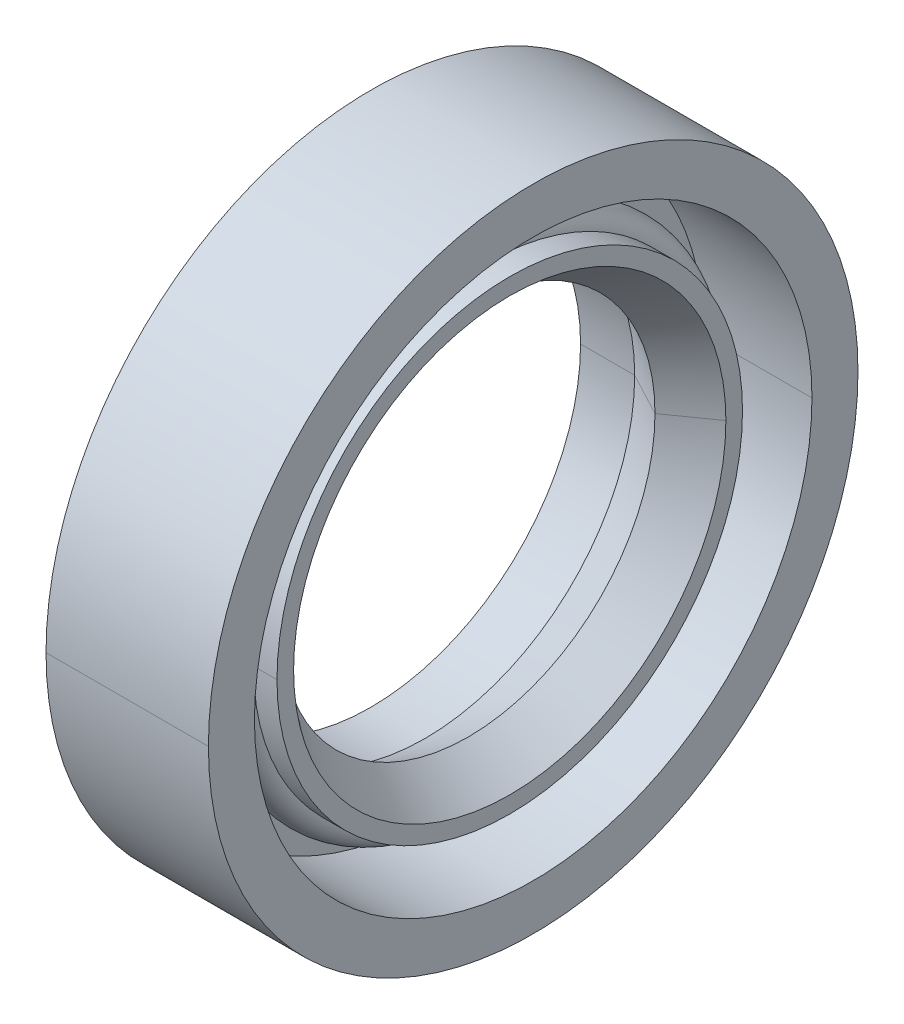
ISO-10303-21;
HEADER;
FILE_DESCRIPTION(('STEP AP214'),'2;1');
FILE_NAME('part.step','',(''),(''),'','','');
FILE_SCHEMA(('AUTOMOTIVE_DESIGN { 1 0 10303 214 1 1 1 1 }'));
ENDSEC;
DATA;
#1=APPLICATION_CONTEXT('core data for automotive mechanical design processes');
#2=APPLICATION_PROTOCOL_DEFINITION('international standard','automotive_design',2000,#1);
#3=PRODUCT_CONTEXT('',#1,'mechanical');
#4=PRODUCT('Part','Part','',(#3));
#5=PRODUCT_RELATED_PRODUCT_CATEGORY('part','',(#4));
#6=PRODUCT_DEFINITION_FORMATION('','',#4);
#7=PRODUCT_DEFINITION_CONTEXT('part definition',#1,'design');
#8=PRODUCT_DEFINITION('design','',#6,#7);
#9=PRODUCT_DEFINITION_SHAPE('','',#8);
#10=(LENGTH_UNIT() NAMED_UNIT(*) SI_UNIT(.MILLI.,.METRE.));
#11=(NAMED_UNIT(*) PLANE_ANGLE_UNIT() SI_UNIT($,.RADIAN.));
#12=(NAMED_UNIT(*) SI_UNIT($,.STERADIAN.) SOLID_ANGLE_UNIT());
#13=UNCERTAINTY_MEASURE_WITH_UNIT(LENGTH_MEASURE(1.E-05),#10,'distance_accuracy_value','');
#14=(GEOMETRIC_REPRESENTATION_CONTEXT(3) GLOBAL_UNCERTAINTY_ASSIGNED_CONTEXT((#13)) GLOBAL_UNIT_ASSIGNED_CONTEXT((#10,
#11,#12)) REPRESENTATION_CONTEXT('',''));
#15=CARTESIAN_POINT('',(0.,0.,0.));
#16=DIRECTION('',(0.,0.,1.));
#17=DIRECTION('',(1.,0.,0.));
#18=AXIS2_PLACEMENT_3D('',#15,#16,#17);
#19=CARTESIAN_POINT('',(10.,0.,0.));
#20=DIRECTION('',(1.,0.,0.));
#21=DIRECTION('',(0.,1.,0.));
#22=AXIS2_PLACEMENT_3D('',#19,#20,#21);
#23=CYLINDRICAL_SURFACE('',#22,20.);
#24=DIRECTION('',(1.,0.,0.));
#25=VECTOR('',#24,1.);
#26=CARTESIAN_POINT('',(0.,0.,20.));
#27=LINE('',#26,#25);
#28=CARTESIAN_POINT('',(0.,0.,20.));
#29=VERTEX_POINT('',#28);
#30=CARTESIAN_POINT('',(10.,0.,20.));
#31=VERTEX_POINT('',#30);
#32=EDGE_CURVE('E10',#29,#31,#27,.T.);
#33=ORIENTED_EDGE('',*,*,#32,.F.);
#34=CARTESIAN_POINT('',(0.,0.,0.));
#35=DIRECTION('',(1.,0.,0.));
#36=DIRECTION('',(0.,0.,-1.));
#37=AXIS2_PLACEMENT_3D('',#34,#35,#36);
#38=CIRCLE('',#37,20.);
#39=CARTESIAN_POINT('',(0.,0.,-20.));
#40=VERTEX_POINT('',#39);
#41=EDGE_CURVE('E24',#29,#40,#38,.T.);
#42=ORIENTED_EDGE('',*,*,#41,.T.);
#43=DIRECTION('',(1.,0.,0.));
#44=VECTOR('',#43,1.);
#45=CARTESIAN_POINT('',(0.,0.,-20.));
#46=LINE('',#45,#44);
#47=CARTESIAN_POINT('',(10.,0.,-20.));
#48=VERTEX_POINT('',#47);
#49=EDGE_CURVE('E319',#40,#48,#46,.T.);
#50=ORIENTED_EDGE('',*,*,#49,.T.);
#51=CARTESIAN_POINT('',(10.,0.,0.));
#52=DIRECTION('',(1.,0.,0.));
#53=DIRECTION('',(0.,0.,-1.));
#54=AXIS2_PLACEMENT_3D('',#51,#52,#53);
#55=CIRCLE('',#54,20.);
#56=EDGE_CURVE('E314',#31,#48,#55,.T.);
#57=ORIENTED_EDGE('',*,*,#56,.F.);
#58=EDGE_LOOP('',(#33,#42,#50,#57));
#59=FACE_BOUND('',#58,.T.);
#60=ADVANCED_FACE('F16',(#59),#23,.T.);
#61=CARTESIAN_POINT('',(10.,17.166666666667,0.));
#62=DIRECTION('',(1.,0.,0.));
#63=DIRECTION('',(0.,0.,-1.));
#64=AXIS2_PLACEMENT_3D('',#61,#62,#63);
#65=PLANE('',#64);
#66=CARTESIAN_POINT('',(10.,0.,0.));
#67=DIRECTION('',(1.,0.,0.));
#68=DIRECTION('',(0.,0.,-1.));
#69=AXIS2_PLACEMENT_3D('',#66,#67,#68);
#70=CIRCLE('',#69,20.);
#71=EDGE_CURVE('E309',#48,#31,#70,.T.);
#72=ORIENTED_EDGE('',*,*,#71,.T.);
#73=ORIENTED_EDGE('',*,*,#56,.T.);
#74=EDGE_LOOP('',(#72,#73));
#75=FACE_BOUND('',#74,.T.);
#76=CARTESIAN_POINT('',(10.,0.,0.));
#77=DIRECTION('',(1.,0.,0.));
#78=DIRECTION('',(0.,0.,-1.));
#79=AXIS2_PLACEMENT_3D('',#76,#77,#78);
#80=CIRCLE('',#79,17.166666666667);
#81=CARTESIAN_POINT('',(10.,0.,17.166666666667));
#82=VERTEX_POINT('',#81);
#83=CARTESIAN_POINT('',(10.,0.,-17.166666666667));
#84=VERTEX_POINT('',#83);
#85=EDGE_CURVE('E304',#82,#84,#80,.T.);
#86=ORIENTED_EDGE('',*,*,#85,.F.);
#87=CARTESIAN_POINT('',(10.,0.,0.));
#88=DIRECTION('',(1.,0.,0.));
#89=DIRECTION('',(0.,0.,-1.));
#90=AXIS2_PLACEMENT_3D('',#87,#88,#89);
#91=CIRCLE('',#90,17.166666666667);
#92=EDGE_CURVE('E299',#84,#82,#91,.T.);
#93=ORIENTED_EDGE('',*,*,#92,.F.);
#94=EDGE_LOOP('',(#86,#93));
#95=FACE_BOUND('',#94,.T.);
#96=ADVANCED_FACE('F332',(#75,#95),#65,.T.);
#97=CARTESIAN_POINT('',(10.,0.,0.));
#98=DIRECTION('',(1.,0.,0.));
#99=DIRECTION('',(0.,-1.,0.));
#100=AXIS2_PLACEMENT_3D('',#97,#98,#99);
#101=CYLINDRICAL_SURFACE('',#100,17.166666666667);
#102=DIRECTION('',(1.,0.,0.));
#103=VECTOR('',#102,1.);
#104=CARTESIAN_POINT('',(3.3333333333333,0.,17.166666666667));
#105=LINE('',#104,#103);
#106=CARTESIAN_POINT('',(3.3333333333333,0.,17.166666666667));
#107=VERTEX_POINT('',#106);
#108=EDGE_CURVE('E294',#107,#82,#105,.T.);
#109=ORIENTED_EDGE('',*,*,#108,.F.);
#110=CARTESIAN_POINT('',(3.3333333333333,0.,0.));
#111=DIRECTION('',(1.,0.,0.));
#112=DIRECTION('',(0.,0.,-1.));
#113=AXIS2_PLACEMENT_3D('',#110,#111,#112);
#114=CIRCLE('',#113,17.166666666667);
#115=CARTESIAN_POINT('',(3.3333333333333,0.,-17.166666666667));
#116=VERTEX_POINT('',#115);
#117=EDGE_CURVE('E289',#116,#107,#114,.T.);
#118=ORIENTED_EDGE('',*,*,#117,.F.);
#119=DIRECTION('',(1.,0.,0.));
#120=VECTOR('',#119,1.);
#121=CARTESIAN_POINT('',(3.3333333333333,0.,-17.166666666667));
#122=LINE('',#121,#120);
#123=EDGE_CURVE('E284',#116,#84,#122,.T.);
#124=ORIENTED_EDGE('',*,*,#123,.T.);
#125=ORIENTED_EDGE('',*,*,#92,.T.);
#126=EDGE_LOOP('',(#109,#118,#124,#125));
#127=FACE_BOUND('',#126,.T.);
#128=ADVANCED_FACE('F335',(#127),#101,.F.);
#129=CARTESIAN_POINT('',(10.,0.,0.));
#130=DIRECTION('',(1.,0.,0.));
#131=DIRECTION('',(0.,1.,0.));
#132=AXIS2_PLACEMENT_3D('',#129,#130,#131);
#133=CYLINDRICAL_SURFACE('',#132,17.166666666667);
#134=ORIENTED_EDGE('',*,*,#108,.T.);
#135=ORIENTED_EDGE('',*,*,#85,.T.);
#136=ORIENTED_EDGE('',*,*,#123,.F.);
#137=CARTESIAN_POINT('',(3.3333333333333,0.,0.));
#138=DIRECTION('',(1.,0.,0.));
#139=DIRECTION('',(0.,0.,-1.));
#140=AXIS2_PLACEMENT_3D('',#137,#138,#139);
#141=CIRCLE('',#140,17.166666666667);
#142=EDGE_CURVE('E279',#107,#116,#141,.T.);
#143=ORIENTED_EDGE('',*,*,#142,.F.);
#144=EDGE_LOOP('',(#134,#135,#136,#143));
#145=FACE_BOUND('',#144,.T.);
#146=ADVANCED_FACE('F339',(#145),#133,.F.);
#147=CARTESIAN_POINT('',(3.3333333333333,14.333333333333,0.));
#148=DIRECTION('',(1.,0.,0.));
#149=DIRECTION('',(0.,0.,-1.));
#150=AXIS2_PLACEMENT_3D('',#147,#148,#149);
#151=PLANE('',#150);
#152=ORIENTED_EDGE('',*,*,#117,.T.);
#153=ORIENTED_EDGE('',*,*,#142,.T.);
#154=EDGE_LOOP('',(#152,#153));
#155=FACE_BOUND('',#154,.T.);
#156=CARTESIAN_POINT('',(3.3333333333333,0.,0.));
#157=DIRECTION('',(1.,0.,0.));
#158=DIRECTION('',(0.,0.,-1.));
#159=AXIS2_PLACEMENT_3D('',#156,#157,#158);
#160=CIRCLE('',#159,14.333333333333);
#161=CARTESIAN_POINT('',(3.3333333333333,0.,14.333333333333));
#162=VERTEX_POINT('',#161);
#163=CARTESIAN_POINT('',(3.3333333333333,0.,-14.333333333333));
#164=VERTEX_POINT('',#163);
#165=EDGE_CURVE('E274',#162,#164,#160,.T.);
#166=ORIENTED_EDGE('',*,*,#165,.F.);
#167=CARTESIAN_POINT('',(3.3333333333333,0.,0.));
#168=DIRECTION('',(1.,0.,0.));
#169=DIRECTION('',(0.,0.,-1.));
#170=AXIS2_PLACEMENT_3D('',#167,#168,#169);
#171=CIRCLE('',#170,14.333333333333);
#172=EDGE_CURVE('E269',#164,#162,#171,.T.);
#173=ORIENTED_EDGE('',*,*,#172,.F.);
#174=EDGE_LOOP('',(#166,#173));
#175=FACE_BOUND('',#174,.T.);
#176=ADVANCED_FACE('F342',(#155,#175),#151,.T.);
#177=CARTESIAN_POINT('',(10.,0.,0.));
#178=DIRECTION('',(1.,0.,0.));
#179=DIRECTION('',(0.,-1.,0.));
#180=AXIS2_PLACEMENT_3D('',#177,#178,#179);
#181=CYLINDRICAL_SURFACE('',#180,14.333333333333);
#182=DIRECTION('',(1.,0.,0.));
#183=VECTOR('',#182,1.);
#184=CARTESIAN_POINT('',(3.3333333333333,0.,14.333333333333));
#185=LINE('',#184,#183);
#186=CARTESIAN_POINT('',(4.888889,0.,14.333333333333));
#187=VERTEX_POINT('',#186);
#188=EDGE_CURVE('E265',#162,#187,#185,.T.);
#189=ORIENTED_EDGE('',*,*,#188,.T.);
#190=CARTESIAN_POINT('',(4.888889,0.,0.));
#191=DIRECTION('',(1.,0.,0.));
#192=DIRECTION('',(0.,0.,-1.));
#193=AXIS2_PLACEMENT_3D('',#190,#191,#192);
#194=CIRCLE('',#193,14.333333333333);
#195=CARTESIAN_POINT('',(4.888889,13.6318100668969,4.42924358604081));
#196=VERTEX_POINT('',#195);
#197=EDGE_CURVE('E260',#196,#187,#194,.T.);
#198=ORIENTED_EDGE('',*,*,#197,.F.);
#199=CARTESIAN_POINT('',(4.888889,0.,0.));
#200=DIRECTION('',(1.,0.,0.));
#201=DIRECTION('',(0.,0.,-1.));
#202=AXIS2_PLACEMENT_3D('',#199,#200,#201);
#203=CIRCLE('',#202,14.333333333333);
#204=CARTESIAN_POINT('',(4.888889,0.,-14.333333333333));
#205=VERTEX_POINT('',#204);
#206=EDGE_CURVE('E255',#205,#196,#203,.T.);
#207=ORIENTED_EDGE('',*,*,#206,.F.);
#208=DIRECTION('',(1.,0.,0.));
#209=VECTOR('',#208,1.);
#210=CARTESIAN_POINT('',(3.3333333333333,0.,-14.333333333333));
#211=LINE('',#210,#209);
#212=EDGE_CURVE('E250',#164,#205,#211,.T.);
#213=ORIENTED_EDGE('',*,*,#212,.F.);
#214=ORIENTED_EDGE('',*,*,#172,.T.);
#215=EDGE_LOOP('',(#189,#198,#207,#213,#214));
#216=FACE_BOUND('',#215,.T.);
#217=ADVANCED_FACE('F345',(#216),#181,.T.);
#218=CARTESIAN_POINT('',(10.,0.,0.));
#219=DIRECTION('',(1.,0.,0.));
#220=DIRECTION('',(0.,1.,0.));
#221=AXIS2_PLACEMENT_3D('',#218,#219,#220);
#222=CYLINDRICAL_SURFACE('',#221,14.333333333333);
#223=ORIENTED_EDGE('',*,*,#188,.F.);
#224=ORIENTED_EDGE('',*,*,#165,.T.);
#225=ORIENTED_EDGE('',*,*,#212,.T.);
#226=CARTESIAN_POINT('',(4.888889,0.,0.));
#227=DIRECTION('',(1.,0.,0.));
#228=DIRECTION('',(0.,0.,-1.));
#229=AXIS2_PLACEMENT_3D('',#226,#227,#228);
#230=CIRCLE('',#229,14.333333333333);
#231=CARTESIAN_POINT('',(4.888889,-13.6318100668969,-4.42924358604081));
#232=VERTEX_POINT('',#231);
#233=EDGE_CURVE('E245',#232,#205,#230,.T.);
#234=ORIENTED_EDGE('',*,*,#233,.F.);
#235=CARTESIAN_POINT('',(4.888889,0.,0.));
#236=DIRECTION('',(1.,0.,0.));
#237=DIRECTION('',(0.,0.,-1.));
#238=AXIS2_PLACEMENT_3D('',#235,#236,#237);
#239=CIRCLE('',#238,14.333333333333);
#240=EDGE_CURVE('E240',#187,#232,#239,.T.);
#241=ORIENTED_EDGE('',*,*,#240,.F.);
#242=EDGE_LOOP('',(#223,#224,#225,#234,#241));
#243=FACE_BOUND('',#242,.T.);
#244=ADVANCED_FACE('F351',(#243),#222,.T.);
#245=CARTESIAN_POINT('',(6.,0.,0.));
#246=DIRECTION('',(1.,0.,0.));
#247=DIRECTION('',(0.,0.309016994374947,-0.951056516295154));
#248=AXIS2_PLACEMENT_3D('',#245,#246,#247);
#249=TOROIDAL_SURFACE('',#248,14.333333333333,1.111111);
#250=CARTESIAN_POINT('',(6.,-13.6318100668969,-4.42924358604081));
#251=DIRECTION('',(0.,0.309016994374947,-0.951056516295154));
#252=DIRECTION('',(1.,0.,0.));
#253=AXIS2_PLACEMENT_3D('',#250,#251,#252);
#254=CIRCLE('',#253,1.111111);
#255=CARTESIAN_POINT('',(7.111111,-13.6318100668969,-4.42924358604081));
#256=VERTEX_POINT('',#255);
#257=EDGE_CURVE('E235',#256,#232,#254,.T.);
#258=ORIENTED_EDGE('',*,*,#257,.F.);
#259=CARTESIAN_POINT('',(7.111111,0.,0.));
#260=DIRECTION('',(1.,0.,0.));
#261=DIRECTION('',(0.,0.,-1.));
#262=AXIS2_PLACEMENT_3D('',#259,#260,#261);
#263=CIRCLE('',#262,14.333333333333);
#264=CARTESIAN_POINT('',(7.111111,0.,14.333333333333));
#265=VERTEX_POINT('',#264);
#266=EDGE_CURVE('E230',#265,#256,#263,.T.);
#267=ORIENTED_EDGE('',*,*,#266,.F.);
#268=CARTESIAN_POINT('',(7.111111,0.,0.));
#269=DIRECTION('',(1.,0.,0.));
#270=DIRECTION('',(0.,0.,-1.));
#271=AXIS2_PLACEMENT_3D('',#268,#269,#270);
#272=CIRCLE('',#271,14.333333333333);
#273=CARTESIAN_POINT('',(7.111111,13.6318100668969,4.42924358604081));
#274=VERTEX_POINT('',#273);
#275=EDGE_CURVE('E225',#274,#265,#272,.T.);
#276=ORIENTED_EDGE('',*,*,#275,.F.);
#277=CARTESIAN_POINT('',(6.,13.6318100668969,4.42924358604081));
#278=DIRECTION('',(0.,-0.309016994374947,0.951056516295154));
#279=DIRECTION('',(1.,0.,0.));
#280=AXIS2_PLACEMENT_3D('',#277,#278,#279);
#281=CIRCLE('',#280,1.111111);
#282=EDGE_CURVE('E220',#274,#196,#281,.T.);
#283=ORIENTED_EDGE('',*,*,#282,.T.);
#284=ORIENTED_EDGE('',*,*,#197,.T.);
#285=ORIENTED_EDGE('',*,*,#240,.T.);
#286=EDGE_LOOP('',(#258,#267,#276,#283,#284,#285));
#287=FACE_BOUND('',#286,.T.);
#288=ADVANCED_FACE('F358',(#287),#249,.T.);
#289=CARTESIAN_POINT('',(6.,0.,0.));
#290=DIRECTION('',(1.,0.,0.));
#291=DIRECTION('',(0.,-0.309016994374947,0.951056516295154));
#292=AXIS2_PLACEMENT_3D('',#289,#290,#291);
#293=TOROIDAL_SURFACE('',#292,14.333333333333,1.111111);
#294=ORIENTED_EDGE('',*,*,#257,.T.);
#295=ORIENTED_EDGE('',*,*,#233,.T.);
#296=ORIENTED_EDGE('',*,*,#206,.T.);
#297=ORIENTED_EDGE('',*,*,#282,.F.);
#298=CARTESIAN_POINT('',(7.111111,0.,0.));
#299=DIRECTION('',(1.,0.,0.));
#300=DIRECTION('',(0.,0.,-1.));
#301=AXIS2_PLACEMENT_3D('',#298,#299,#300);
#302=CIRCLE('',#301,14.333333333333);
#303=CARTESIAN_POINT('',(7.111111,0.,-14.333333333333));
#304=VERTEX_POINT('',#303);
#305=EDGE_CURVE('E215',#304,#274,#302,.T.);
#306=ORIENTED_EDGE('',*,*,#305,.F.);
#307=CARTESIAN_POINT('',(7.111111,0.,0.));
#308=DIRECTION('',(1.,0.,0.));
#309=DIRECTION('',(0.,0.,-1.));
#310=AXIS2_PLACEMENT_3D('',#307,#308,#309);
#311=CIRCLE('',#310,14.333333333333);
#312=EDGE_CURVE('E210',#256,#304,#311,.T.);
#313=ORIENTED_EDGE('',*,*,#312,.F.);
#314=EDGE_LOOP('',(#294,#295,#296,#297,#306,#313));
#315=FACE_BOUND('',#314,.T.);
#316=ADVANCED_FACE('F354',(#315),#293,.T.);
#317=CARTESIAN_POINT('',(10.,0.,0.));
#318=DIRECTION('',(1.,0.,0.));
#319=DIRECTION('',(0.,1.,0.));
#320=AXIS2_PLACEMENT_3D('',#317,#318,#319);
#321=CYLINDRICAL_SURFACE('',#320,14.333333333333);
#322=DIRECTION('',(1.,0.,0.));
#323=VECTOR('',#322,1.);
#324=CARTESIAN_POINT('',(7.111111,0.,14.333333333333));
#325=LINE('',#324,#323);
#326=CARTESIAN_POINT('',(8.5555555,0.,14.333333333333));
#327=VERTEX_POINT('',#326);
#328=EDGE_CURVE('E205',#265,#327,#325,.T.);
#329=ORIENTED_EDGE('',*,*,#328,.F.);
#330=ORIENTED_EDGE('',*,*,#266,.T.);
#331=ORIENTED_EDGE('',*,*,#312,.T.);
#332=DIRECTION('',(1.,0.,0.));
#333=VECTOR('',#332,1.);
#334=CARTESIAN_POINT('',(7.111111,0.,-14.333333333333));
#335=LINE('',#334,#333);
#336=CARTESIAN_POINT('',(8.5555555,0.,-14.333333333333));
#337=VERTEX_POINT('',#336);
#338=EDGE_CURVE('E201',#304,#337,#335,.T.);
#339=ORIENTED_EDGE('',*,*,#338,.T.);
#340=CARTESIAN_POINT('',(8.5555555,0.,0.));
#341=DIRECTION('',(1.,0.,0.));
#342=DIRECTION('',(0.,0.,-1.));
#343=AXIS2_PLACEMENT_3D('',#340,#341,#342);
#344=CIRCLE('',#343,14.333333333333);
#345=EDGE_CURVE('E196',#327,#337,#344,.T.);
#346=ORIENTED_EDGE('',*,*,#345,.F.);
#347=EDGE_LOOP('',(#329,#330,#331,#339,#346));
#348=FACE_BOUND('',#347,.T.);
#349=ADVANCED_FACE('F363',(#348),#321,.T.);
#350=CARTESIAN_POINT('',(8.5555555,13.310185145833,0.));
#351=DIRECTION('',(1.,0.,0.));
#352=DIRECTION('',(0.,0.,-1.));
#353=AXIS2_PLACEMENT_3D('',#350,#351,#352);
#354=PLANE('',#353);
#355=CARTESIAN_POINT('',(8.5555555,0.,0.));
#356=DIRECTION('',(1.,0.,0.));
#357=DIRECTION('',(0.,0.,-1.));
#358=AXIS2_PLACEMENT_3D('',#355,#356,#357);
#359=CIRCLE('',#358,14.333333333333);
#360=EDGE_CURVE('E191',#337,#327,#359,.T.);
#361=ORIENTED_EDGE('',*,*,#360,.T.);
#362=ORIENTED_EDGE('',*,*,#345,.T.);
#363=EDGE_LOOP('',(#361,#362));
#364=FACE_BOUND('',#363,.T.);
#365=CARTESIAN_POINT('',(8.5555555,0.,0.));
#366=DIRECTION('',(1.,0.,0.));
#367=DIRECTION('',(0.,0.,-1.));
#368=AXIS2_PLACEMENT_3D('',#365,#366,#367);
#369=CIRCLE('',#368,13.310185145833);
#370=CARTESIAN_POINT('',(8.5555555,0.,13.310185145833));
#371=VERTEX_POINT('',#370);
#372=CARTESIAN_POINT('',(8.5555555,0.,-13.310185145833));
#373=VERTEX_POINT('',#372);
#374=EDGE_CURVE('E186',#371,#373,#369,.T.);
#375=ORIENTED_EDGE('',*,*,#374,.F.);
#376=CARTESIAN_POINT('',(8.5555555,0.,0.));
#377=DIRECTION('',(1.,0.,0.));
#378=DIRECTION('',(0.,0.,-1.));
#379=AXIS2_PLACEMENT_3D('',#376,#377,#378);
#380=CIRCLE('',#379,13.310185145833);
#381=EDGE_CURVE('E181',#373,#371,#380,.T.);
#382=ORIENTED_EDGE('',*,*,#381,.F.);
#383=EDGE_LOOP('',(#375,#382));
#384=FACE_BOUND('',#383,.T.);
#385=ADVANCED_FACE('F367',(#364,#384),#354,.T.);
#386=CARTESIAN_POINT('',(6.,0.,0.));
#387=DIRECTION('',(1.,0.,0.));
#388=DIRECTION('',(0.,-1.,0.));
#389=AXIS2_PLACEMENT_3D('',#386,#387,#388);
#390=CONICAL_SURFACE('',#389,11.5,0.616296937395985);
#391=DIRECTION('',(0.816024481101705,0.,0.578017340780268));
#392=VECTOR('',#391,1.);
#393=CARTESIAN_POINT('',(6.,0.,11.5));
#394=LINE('',#393,#392);
#395=CARTESIAN_POINT('',(6.,0.,11.5));
#396=VERTEX_POINT('',#395);
#397=EDGE_CURVE('E176',#396,#371,#394,.T.);
#398=ORIENTED_EDGE('',*,*,#397,.F.);
#399=CARTESIAN_POINT('',(6.,0.,0.));
#400=DIRECTION('',(1.,0.,0.));
#401=DIRECTION('',(0.,0.,-1.));
#402=AXIS2_PLACEMENT_3D('',#399,#400,#401);
#403=CIRCLE('',#402,11.5);
#404=CARTESIAN_POINT('',(6.,0.,-11.5));
#405=VERTEX_POINT('',#404);
#406=EDGE_CURVE('E171',#405,#396,#403,.T.);
#407=ORIENTED_EDGE('',*,*,#406,.F.);
#408=DIRECTION('',(0.816024481101705,0.,-0.578017340780268));
#409=VECTOR('',#408,1.);
#410=CARTESIAN_POINT('',(6.,0.,-11.5));
#411=LINE('',#410,#409);
#412=EDGE_CURVE('E166',#405,#373,#411,.T.);
#413=ORIENTED_EDGE('',*,*,#412,.T.);
#414=ORIENTED_EDGE('',*,*,#381,.T.);
#415=EDGE_LOOP('',(#398,#407,#413,#414));
#416=FACE_BOUND('',#415,.T.);
#417=ADVANCED_FACE('F370',(#416),#390,.F.);
#418=CARTESIAN_POINT('',(6.,0.,0.));
#419=DIRECTION('',(1.,0.,0.));
#420=DIRECTION('',(0.,1.,0.));
#421=AXIS2_PLACEMENT_3D('',#418,#419,#420);
#422=CONICAL_SURFACE('',#421,11.5,0.616296937395985);
#423=ORIENTED_EDGE('',*,*,#397,.T.);
#424=ORIENTED_EDGE('',*,*,#374,.T.);
#425=ORIENTED_EDGE('',*,*,#412,.F.);
#426=CARTESIAN_POINT('',(6.,0.,0.));
#427=DIRECTION('',(1.,0.,0.));
#428=DIRECTION('',(0.,0.,-1.));
#429=AXIS2_PLACEMENT_3D('',#426,#427,#428);
#430=CIRCLE('',#429,11.5);
#431=EDGE_CURVE('E161',#396,#405,#430,.T.);
#432=ORIENTED_EDGE('',*,*,#431,.F.);
#433=EDGE_LOOP('',(#423,#424,#425,#432));
#434=FACE_BOUND('',#433,.T.);
#435=ADVANCED_FACE('F375',(#434),#422,.F.);
#436=CARTESIAN_POINT('',(3.3333333333333,0.,0.));
#437=DIRECTION('',(-1.,0.,0.));
#438=DIRECTION('',(0.,1.,0.));
#439=AXIS2_PLACEMENT_3D('',#436,#437,#438);
#440=CONICAL_SURFACE('',#439,12.916666666667,0.488333951056498);
#441=DIRECTION('',(-0.883115719457367,0.,-0.469155225961831));
#442=VECTOR('',#441,1.);
#443=CARTESIAN_POINT('',(6.,0.,-11.5));
#444=LINE('',#443,#442);
#445=CARTESIAN_POINT('',(3.3333333333333,0.,-12.916666666667));
#446=VERTEX_POINT('',#445);
#447=EDGE_CURVE('E157',#405,#446,#444,.T.);
#448=ORIENTED_EDGE('',*,*,#447,.T.);
#449=CARTESIAN_POINT('',(3.3333333333333,0.,0.));
#450=DIRECTION('',(1.,0.,0.));
#451=DIRECTION('',(0.,0.,-1.));
#452=AXIS2_PLACEMENT_3D('',#449,#450,#451);
#453=CIRCLE('',#452,12.916666666667);
#454=CARTESIAN_POINT('',(3.3333333333333,0.,12.916666666667));
#455=VERTEX_POINT('',#454);
#456=EDGE_CURVE('E128',#455,#446,#453,.T.);
#457=ORIENTED_EDGE('',*,*,#456,.F.);
#458=DIRECTION('',(-0.883115719457367,0.,0.469155225961831));
#459=VECTOR('',#458,1.);
#460=CARTESIAN_POINT('',(6.,0.,11.5));
#461=LINE('',#460,#459);
#462=EDGE_CURVE('E149',#396,#455,#461,.T.);
#463=ORIENTED_EDGE('',*,*,#462,.F.);
#464=ORIENTED_EDGE('',*,*,#431,.T.);
#465=EDGE_LOOP('',(#448,#457,#463,#464));
#466=FACE_BOUND('',#465,.T.);
#467=ADVANCED_FACE('F380',(#466),#440,.F.);
#468=CARTESIAN_POINT('',(3.3333333333333,0.,0.));
#469=DIRECTION('',(-1.,0.,0.));
#470=DIRECTION('',(0.,-1.,0.));
#471=AXIS2_PLACEMENT_3D('',#468,#469,#470);
#472=CONICAL_SURFACE('',#471,12.916666666667,0.488333951056498);
#473=ORIENTED_EDGE('',*,*,#447,.F.);
#474=ORIENTED_EDGE('',*,*,#406,.T.);
#475=ORIENTED_EDGE('',*,*,#462,.T.);
#476=CARTESIAN_POINT('',(3.3333333333333,0.,0.));
#477=DIRECTION('',(1.,0.,0.));
#478=DIRECTION('',(0.,0.,-1.));
#479=AXIS2_PLACEMENT_3D('',#476,#477,#478);
#480=CIRCLE('',#479,12.916666666667);
#481=EDGE_CURVE('E145',#446,#455,#480,.T.);
#482=ORIENTED_EDGE('',*,*,#481,.F.);
#483=EDGE_LOOP('',(#473,#474,#475,#482));
#484=FACE_BOUND('',#483,.T.);
#485=ADVANCED_FACE('F383',(#484),#472,.F.);
#486=CARTESIAN_POINT('',(10.,0.,0.));
#487=DIRECTION('',(1.,0.,0.));
#488=DIRECTION('',(0.,-1.,-2.35750880282901E-12));
#489=AXIS2_PLACEMENT_3D('',#486,#487,#488);
#490=CYLINDRICAL_SURFACE('',#489,12.916666666667);
#491=DIRECTION('',(1.,0.,0.));
#492=VECTOR('',#491,1.);
#493=CARTESIAN_POINT('',(0.,0.,12.916666666667));
#494=LINE('',#493,#492);
#495=CARTESIAN_POINT('',(0.,0.,12.916666666667));
#496=VERTEX_POINT('',#495);
#497=EDGE_CURVE('E120',#496,#455,#494,.T.);
#498=ORIENTED_EDGE('',*,*,#497,.F.);
#499=CARTESIAN_POINT('',(0.,0.,0.));
#500=DIRECTION('',(1.,0.,0.));
#501=DIRECTION('',(0.,0.,-1.));
#502=AXIS2_PLACEMENT_3D('',#499,#500,#501);
#503=CIRCLE('',#502,12.916666666667);
#504=CARTESIAN_POINT('',(0.,0.,-12.916666666667));
#505=VERTEX_POINT('',#504);
#506=EDGE_CURVE('E113',#505,#496,#503,.T.);
#507=ORIENTED_EDGE('',*,*,#506,.F.);
#508=DIRECTION('',(1.,0.,0.));
#509=VECTOR('',#508,1.);
#510=CARTESIAN_POINT('',(0.,0.,-12.916666666667));
#511=LINE('',#510,#509);
#512=EDGE_CURVE('E117',#505,#446,#511,.T.);
#513=ORIENTED_EDGE('',*,*,#512,.T.);
#514=ORIENTED_EDGE('',*,*,#481,.T.);
#515=EDGE_LOOP('',(#498,#507,#513,#514));
#516=FACE_BOUND('',#515,.T.);
#517=ADVANCED_FACE('F115',(#516),#490,.F.);
#518=CARTESIAN_POINT('',(10.,0.,0.));
#519=DIRECTION('',(1.,0.,0.));
#520=DIRECTION('',(0.,1.,0.));
#521=AXIS2_PLACEMENT_3D('',#518,#519,#520);
#522=CYLINDRICAL_SURFACE('',#521,12.916666666667);
#523=ORIENTED_EDGE('',*,*,#497,.T.);
#524=ORIENTED_EDGE('',*,*,#456,.T.);
#525=ORIENTED_EDGE('',*,*,#512,.F.);
#526=CARTESIAN_POINT('',(0.,0.,0.));
#527=DIRECTION('',(1.,0.,0.));
#528=DIRECTION('',(0.,0.,-1.));
#529=AXIS2_PLACEMENT_3D('',#526,#527,#528);
#530=CIRCLE('',#529,12.916666666667);
#531=EDGE_CURVE('E127',#496,#505,#530,.T.);
#532=ORIENTED_EDGE('',*,*,#531,.F.);
#533=EDGE_LOOP('',(#523,#524,#525,#532));
#534=FACE_BOUND('',#533,.T.);
#535=ADVANCED_FACE('F126',(#534),#522,.F.);
#536=CARTESIAN_POINT('',(0.,20.,0.));
#537=DIRECTION('',(-1.,0.,0.));
#538=DIRECTION('',(0.,0.,1.));
#539=AXIS2_PLACEMENT_3D('',#536,#537,#538);
#540=PLANE('',#539);
#541=ORIENTED_EDGE('',*,*,#506,.T.);
#542=ORIENTED_EDGE('',*,*,#531,.T.);
#543=EDGE_LOOP('',(#541,#542));
#544=FACE_BOUND('',#543,.T.);
#545=ORIENTED_EDGE('',*,*,#41,.F.);
#546=CARTESIAN_POINT('',(0.,0.,0.));
#547=DIRECTION('',(1.,0.,0.));
#548=DIRECTION('',(0.,0.,-1.));
#549=AXIS2_PLACEMENT_3D('',#546,#547,#548);
#550=CIRCLE('',#549,20.);
#551=EDGE_CURVE('E132',#40,#29,#550,.T.);
#552=ORIENTED_EDGE('',*,*,#551,.F.);
#553=EDGE_LOOP('',(#545,#552));
#554=FACE_BOUND('',#553,.T.);
#555=ADVANCED_FACE('F130',(#544,#554),#540,.T.);
#556=CARTESIAN_POINT('',(10.,0.,0.));
#557=DIRECTION('',(1.,0.,0.));
#558=DIRECTION('',(0.,-1.,0.));
#559=AXIS2_PLACEMENT_3D('',#556,#557,#558);
#560=CYLINDRICAL_SURFACE('',#559,20.);
#561=ORIENTED_EDGE('',*,*,#32,.T.);
#562=ORIENTED_EDGE('',*,*,#71,.F.);
#563=ORIENTED_EDGE('',*,*,#49,.F.);
#564=ORIENTED_EDGE('',*,*,#551,.T.);
#565=EDGE_LOOP('',(#561,#562,#563,#564));
#566=FACE_BOUND('',#565,.T.);
#567=ADVANCED_FACE('F330',(#566),#560,.T.);
#568=CARTESIAN_POINT('',(10.,0.,0.));
#569=DIRECTION('',(1.,0.,0.));
#570=DIRECTION('',(0.,-1.,0.));
#571=AXIS2_PLACEMENT_3D('',#568,#569,#570);
#572=CYLINDRICAL_SURFACE('',#571,14.333333333333);
#573=ORIENTED_EDGE('',*,*,#328,.T.);
#574=ORIENTED_EDGE('',*,*,#360,.F.);
#575=ORIENTED_EDGE('',*,*,#338,.F.);
#576=ORIENTED_EDGE('',*,*,#305,.T.);
#577=ORIENTED_EDGE('',*,*,#275,.T.);
#578=EDGE_LOOP('',(#573,#574,#575,#576,#577));
#579=FACE_BOUND('',#578,.T.);
#580=ADVANCED_FACE('F365',(#579),#572,.T.);
#581=CLOSED_SHELL('',(#60,#96,#128,#146,#176,#217,#244,#288,#316,#349,#385,#417,#435,#467,#485,
#517,#535,#555,#567,#580));
#582=MANIFOLD_SOLID_BREP('B1',#581);
#583=ADVANCED_BREP_SHAPE_REPRESENTATION('',(#18,#582),#14);
#584=SHAPE_DEFINITION_REPRESENTATION(#9,#583);
ENDSEC;
END-ISO-10303-21;
